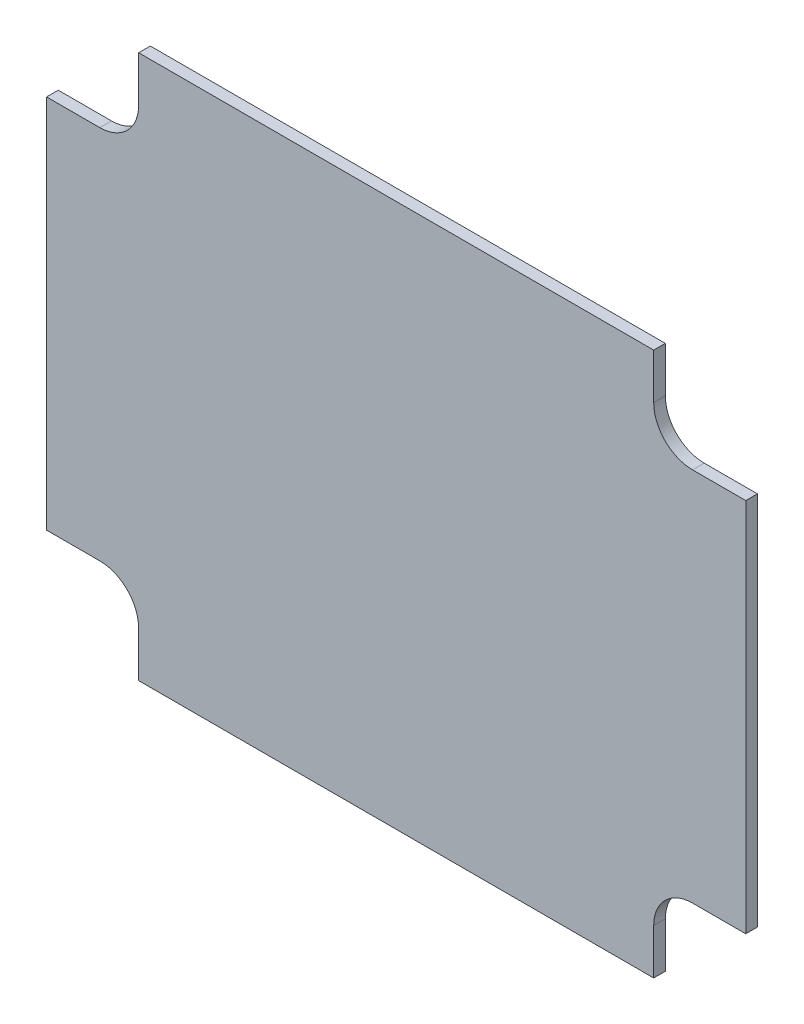
ISO-10303-21;
HEADER;
FILE_DESCRIPTION(('STEP AP214'),'2;1');
FILE_NAME('part.step','',(''),(''),'','','');
FILE_SCHEMA(('AUTOMOTIVE_DESIGN { 1 0 10303 214 1 1 1 1 }'));
ENDSEC;
DATA;
#1=APPLICATION_CONTEXT('core data for automotive mechanical design processes');
#2=APPLICATION_PROTOCOL_DEFINITION('international standard','automotive_design',2000,#1);
#3=PRODUCT_CONTEXT('',#1,'mechanical');
#4=PRODUCT('Part','Part','',(#3));
#5=PRODUCT_RELATED_PRODUCT_CATEGORY('part','',(#4));
#6=PRODUCT_DEFINITION_FORMATION('','',#4);
#7=PRODUCT_DEFINITION_CONTEXT('part definition',#1,'design');
#8=PRODUCT_DEFINITION('design','',#6,#7);
#9=PRODUCT_DEFINITION_SHAPE('','',#8);
#10=(LENGTH_UNIT() NAMED_UNIT(*) SI_UNIT(.MILLI.,.METRE.));
#11=(NAMED_UNIT(*) PLANE_ANGLE_UNIT() SI_UNIT($,.RADIAN.));
#12=(NAMED_UNIT(*) SI_UNIT($,.STERADIAN.) SOLID_ANGLE_UNIT());
#13=UNCERTAINTY_MEASURE_WITH_UNIT(LENGTH_MEASURE(1.E-05),#10,'distance_accuracy_value','');
#14=(GEOMETRIC_REPRESENTATION_CONTEXT(3) GLOBAL_UNCERTAINTY_ASSIGNED_CONTEXT((#13)) GLOBAL_UNIT_ASSIGNED_CONTEXT((#10,
#11,#12)) REPRESENTATION_CONTEXT('',''));
#15=CARTESIAN_POINT('',(0.,0.,0.));
#16=DIRECTION('',(0.,0.,1.));
#17=DIRECTION('',(1.,0.,0.));
#18=AXIS2_PLACEMENT_3D('',#15,#16,#17);
#19=CARTESIAN_POINT('',(-33.22373701131,0.,1.5));
#20=DIRECTION('',(-1.,0.,0.));
#21=DIRECTION('',(0.,-1.,0.));
#22=AXIS2_PLACEMENT_3D('',#19,#20,#21);
#23=PLANE('',#22);
#24=DIRECTION('',(0.,1.,0.));
#25=VECTOR('',#24,1.);
#26=CARTESIAN_POINT('',(-33.22373701131,0.,0.));
#27=LINE('',#26,#25);
#28=CARTESIAN_POINT('',(-33.2237370113099,28.3137276237492,0.));
#29=VERTEX_POINT('',#28);
#30=CARTESIAN_POINT('',(-33.2237370113099,34.1637276237492,0.));
#31=VERTEX_POINT('',#30);
#32=EDGE_CURVE('E200',#29,#31,#27,.T.);
#33=ORIENTED_EDGE('',*,*,#32,.F.);
#34=DIRECTION('',(0.,0.,-1.));
#35=VECTOR('',#34,1.);
#36=CARTESIAN_POINT('',(-33.2237370113099,28.3137276237492,1.5));
#37=LINE('',#36,#35);
#38=CARTESIAN_POINT('',(-33.2237370113099,28.3137276237492,1.5));
#39=VERTEX_POINT('',#38);
#40=EDGE_CURVE('E54',#29,#39,#37,.F.);
#41=ORIENTED_EDGE('',*,*,#40,.T.);
#42=DIRECTION('',(0.,1.,0.));
#43=VECTOR('',#42,1.);
#44=CARTESIAN_POINT('',(-33.22373701131,0.,1.5));
#45=LINE('',#44,#43);
#46=CARTESIAN_POINT('',(-33.2237370113099,34.1637276237492,1.5));
#47=VERTEX_POINT('',#46);
#48=EDGE_CURVE('E161',#39,#47,#45,.T.);
#49=ORIENTED_EDGE('',*,*,#48,.T.);
#50=DIRECTION('',(0.,0.,-1.));
#51=VECTOR('',#50,1.);
#52=CARTESIAN_POINT('',(-33.2237370113099,34.1637276237492,1.5));
#53=LINE('',#52,#51);
#54=EDGE_CURVE('E199',#47,#31,#53,.T.);
#55=ORIENTED_EDGE('',*,*,#54,.T.);
#56=EDGE_LOOP('',(#33,#41,#49,#55));
#57=FACE_BOUND('',#56,.T.);
#58=ADVANCED_FACE('F39',(#57),#23,.T.);
#59=CARTESIAN_POINT('',(0.,23.3137276237492,1.5));
#60=DIRECTION('',(0.,-1.,0.));
#61=DIRECTION('',(1.,0.,0.));
#62=AXIS2_PLACEMENT_3D('',#59,#60,#61);
#63=PLANE('',#62);
#64=DIRECTION('',(-1.,0.,0.));
#65=VECTOR('',#64,1.);
#66=CARTESIAN_POINT('',(0.,23.3137276237492,1.5));
#67=LINE('',#66,#65);
#68=CARTESIAN_POINT('',(-38.2237370113099,23.3137276237492,1.5));
#69=VERTEX_POINT('',#68);
#70=CARTESIAN_POINT('',(-45.0737370113099,23.3137276237492,1.5));
#71=VERTEX_POINT('',#70);
#72=EDGE_CURVE('E150',#69,#71,#67,.T.);
#73=ORIENTED_EDGE('',*,*,#72,.F.);
#74=DIRECTION('',(0.,0.,-1.));
#75=VECTOR('',#74,1.);
#76=CARTESIAN_POINT('',(-38.2237370113099,23.3137276237492,1.5));
#77=LINE('',#76,#75);
#78=CARTESIAN_POINT('',(-38.2237370113099,23.3137276237492,0.));
#79=VERTEX_POINT('',#78);
#80=EDGE_CURVE('E258',#69,#79,#77,.T.);
#81=ORIENTED_EDGE('',*,*,#80,.T.);
#82=DIRECTION('',(-1.,0.,0.));
#83=VECTOR('',#82,1.);
#84=CARTESIAN_POINT('',(0.,23.3137276237492,0.));
#85=LINE('',#84,#83);
#86=CARTESIAN_POINT('',(-45.0737370113099,23.3137276237492,0.));
#87=VERTEX_POINT('',#86);
#88=EDGE_CURVE('E166',#79,#87,#85,.T.);
#89=ORIENTED_EDGE('',*,*,#88,.T.);
#90=DIRECTION('',(0.,0.,-1.));
#91=VECTOR('',#90,1.);
#92=CARTESIAN_POINT('',(-45.0737370113099,23.3137276237492,1.5));
#93=LINE('',#92,#91);
#94=EDGE_CURVE('E164',#71,#87,#93,.T.);
#95=ORIENTED_EDGE('',*,*,#94,.F.);
#96=EDGE_LOOP('',(#73,#81,#89,#95));
#97=FACE_BOUND('',#96,.T.);
#98=ADVANCED_FACE('F165',(#97),#63,.F.);
#99=CARTESIAN_POINT('',(-45.0737370113099,0.,1.5));
#100=DIRECTION('',(1.,0.,0.));
#101=DIRECTION('',(0.,0.,-1.));
#102=AXIS2_PLACEMENT_3D('',#99,#100,#101);
#103=PLANE('',#102);
#104=DIRECTION('',(0.,-1.,0.));
#105=VECTOR('',#104,1.);
#106=CARTESIAN_POINT('',(-45.0737370113099,0.,0.));
#107=LINE('',#106,#105);
#108=CARTESIAN_POINT('',(-45.0737370113099,-24.9862723762508,0.));
#109=VERTEX_POINT('',#108);
#110=EDGE_CURVE('E203',#87,#109,#107,.T.);
#111=ORIENTED_EDGE('',*,*,#110,.T.);
#112=DIRECTION('',(0.,0.,-1.));
#113=VECTOR('',#112,1.);
#114=CARTESIAN_POINT('',(-45.0737370113099,-24.9862723762508,1.5));
#115=LINE('',#114,#113);
#116=CARTESIAN_POINT('',(-45.0737370113099,-24.9862723762508,1.5));
#117=VERTEX_POINT('',#116);
#118=EDGE_CURVE('E171',#117,#109,#115,.T.);
#119=ORIENTED_EDGE('',*,*,#118,.F.);
#120=DIRECTION('',(0.,-1.,0.));
#121=VECTOR('',#120,1.);
#122=CARTESIAN_POINT('',(-45.0737370113099,0.,1.5));
#123=LINE('',#122,#121);
#124=EDGE_CURVE('E155',#71,#117,#123,.T.);
#125=ORIENTED_EDGE('',*,*,#124,.F.);
#126=ORIENTED_EDGE('',*,*,#94,.T.);
#127=EDGE_LOOP('',(#111,#119,#125,#126));
#128=FACE_BOUND('',#127,.T.);
#129=ADVANCED_FACE('F173',(#128),#103,.F.);
#130=CARTESIAN_POINT('',(0.,-24.9862723762508,1.5));
#131=DIRECTION('',(0.,-1.,0.));
#132=DIRECTION('',(0.,0.,-1.));
#133=AXIS2_PLACEMENT_3D('',#130,#131,#132);
#134=PLANE('',#133);
#135=DIRECTION('',(-1.,0.,0.));
#136=VECTOR('',#135,1.);
#137=CARTESIAN_POINT('',(0.,-24.9862723762508,0.));
#138=LINE('',#137,#136);
#139=CARTESIAN_POINT('',(-38.2237370113099,-24.9862723762508,0.));
#140=VERTEX_POINT('',#139);
#141=EDGE_CURVE('E205',#140,#109,#138,.T.);
#142=ORIENTED_EDGE('',*,*,#141,.F.);
#143=DIRECTION('',(0.,0.,-1.));
#144=VECTOR('',#143,1.);
#145=CARTESIAN_POINT('',(-38.2237370113099,-24.9862723762508,1.5));
#146=LINE('',#145,#144);
#147=CARTESIAN_POINT('',(-38.2237370113099,-24.9862723762508,1.5));
#148=VERTEX_POINT('',#147);
#149=EDGE_CURVE('E246',#140,#148,#146,.F.);
#150=ORIENTED_EDGE('',*,*,#149,.T.);
#151=DIRECTION('',(-1.,0.,0.));
#152=VECTOR('',#151,1.);
#153=CARTESIAN_POINT('',(0.,-24.9862723762508,1.5));
#154=LINE('',#153,#152);
#155=EDGE_CURVE('E175',#148,#117,#154,.T.);
#156=ORIENTED_EDGE('',*,*,#155,.T.);
#157=ORIENTED_EDGE('',*,*,#118,.T.);
#158=EDGE_LOOP('',(#142,#150,#156,#157));
#159=FACE_BOUND('',#158,.T.);
#160=ADVANCED_FACE('F324',(#159),#134,.T.);
#161=CARTESIAN_POINT('',(-33.2237370113099,0.,1.5));
#162=DIRECTION('',(1.,0.,0.));
#163=DIRECTION('',(0.,0.,-1.));
#164=AXIS2_PLACEMENT_3D('',#161,#162,#163);
#165=PLANE('',#164);
#166=DIRECTION('',(0.,-1.,0.));
#167=VECTOR('',#166,1.);
#168=CARTESIAN_POINT('',(-33.2237370113099,0.,1.5));
#169=LINE('',#168,#167);
#170=CARTESIAN_POINT('',(-33.2237370113099,-29.9862723762508,1.5));
#171=VERTEX_POINT('',#170);
#172=CARTESIAN_POINT('',(-33.2237370113099,-35.8362723762508,1.5));
#173=VERTEX_POINT('',#172);
#174=EDGE_CURVE('E177',#171,#173,#169,.T.);
#175=ORIENTED_EDGE('',*,*,#174,.F.);
#176=DIRECTION('',(0.,0.,-1.));
#177=VECTOR('',#176,1.);
#178=CARTESIAN_POINT('',(-33.2237370113099,-29.9862723762508,1.5));
#179=LINE('',#178,#177);
#180=CARTESIAN_POINT('',(-33.2237370113099,-29.9862723762508,0.));
#181=VERTEX_POINT('',#180);
#182=EDGE_CURVE('E170',#171,#181,#179,.T.);
#183=ORIENTED_EDGE('',*,*,#182,.T.);
#184=DIRECTION('',(0.,-1.,0.));
#185=VECTOR('',#184,1.);
#186=CARTESIAN_POINT('',(-33.2237370113099,0.,0.));
#187=LINE('',#186,#185);
#188=CARTESIAN_POINT('',(-33.2237370113099,-35.8362723762508,0.));
#189=VERTEX_POINT('',#188);
#190=EDGE_CURVE('E207',#181,#189,#187,.T.);
#191=ORIENTED_EDGE('',*,*,#190,.T.);
#192=DIRECTION('',(0.,0.,-1.));
#193=VECTOR('',#192,1.);
#194=CARTESIAN_POINT('',(-33.2237370113099,-35.8362723762508,1.5));
#195=LINE('',#194,#193);
#196=EDGE_CURVE('E240',#173,#189,#195,.T.);
#197=ORIENTED_EDGE('',*,*,#196,.F.);
#198=EDGE_LOOP('',(#175,#183,#191,#197));
#199=FACE_BOUND('',#198,.T.);
#200=ADVANCED_FACE('F317',(#199),#165,.F.);
#201=CARTESIAN_POINT('',(0.,-35.8362723762508,1.5));
#202=DIRECTION('',(0.,1.,0.));
#203=DIRECTION('',(0.,0.,1.));
#204=AXIS2_PLACEMENT_3D('',#201,#202,#203);
#205=PLANE('',#204);
#206=DIRECTION('',(1.,0.,0.));
#207=VECTOR('',#206,1.);
#208=CARTESIAN_POINT('',(0.,-35.8362723762508,0.));
#209=LINE('',#208,#207);
#210=CARTESIAN_POINT('',(33.0762629886901,-35.8362723762508,0.));
#211=VERTEX_POINT('',#210);
#212=EDGE_CURVE('E209',#189,#211,#209,.T.);
#213=ORIENTED_EDGE('',*,*,#212,.T.);
#214=DIRECTION('',(0.,0.,-1.));
#215=VECTOR('',#214,1.);
#216=CARTESIAN_POINT('',(33.0762629886901,-35.8362723762508,1.5));
#217=LINE('',#216,#215);
#218=CARTESIAN_POINT('',(33.0762629886901,-35.8362723762508,1.5));
#219=VERTEX_POINT('',#218);
#220=EDGE_CURVE('E237',#219,#211,#217,.T.);
#221=ORIENTED_EDGE('',*,*,#220,.F.);
#222=DIRECTION('',(1.,0.,0.));
#223=VECTOR('',#222,1.);
#224=CARTESIAN_POINT('',(0.,-35.8362723762508,1.5));
#225=LINE('',#224,#223);
#226=EDGE_CURVE('E182',#173,#219,#225,.T.);
#227=ORIENTED_EDGE('',*,*,#226,.F.);
#228=ORIENTED_EDGE('',*,*,#196,.T.);
#229=EDGE_LOOP('',(#213,#221,#227,#228));
#230=FACE_BOUND('',#229,.T.);
#231=ADVANCED_FACE('F312',(#230),#205,.F.);
#232=CARTESIAN_POINT('',(33.0762629886901,0.,1.5));
#233=DIRECTION('',(1.,0.,0.));
#234=DIRECTION('',(0.,0.,-1.));
#235=AXIS2_PLACEMENT_3D('',#232,#233,#234);
#236=PLANE('',#235);
#237=DIRECTION('',(0.,-1.,0.));
#238=VECTOR('',#237,1.);
#239=CARTESIAN_POINT('',(33.0762629886901,0.,0.));
#240=LINE('',#239,#238);
#241=CARTESIAN_POINT('',(33.0762629886901,-29.9862723762508,0.));
#242=VERTEX_POINT('',#241);
#243=EDGE_CURVE('E212',#242,#211,#240,.T.);
#244=ORIENTED_EDGE('',*,*,#243,.F.);
#245=DIRECTION('',(0.,0.,-1.));
#246=VECTOR('',#245,1.);
#247=CARTESIAN_POINT('',(33.0762629886901,-29.9862723762508,1.5));
#248=LINE('',#247,#246);
#249=CARTESIAN_POINT('',(33.0762629886901,-29.9862723762508,1.5));
#250=VERTEX_POINT('',#249);
#251=EDGE_CURVE('E251',#242,#250,#248,.F.);
#252=ORIENTED_EDGE('',*,*,#251,.T.);
#253=DIRECTION('',(0.,-1.,0.));
#254=VECTOR('',#253,1.);
#255=CARTESIAN_POINT('',(33.0762629886901,0.,1.5));
#256=LINE('',#255,#254);
#257=EDGE_CURVE('E185',#250,#219,#256,.T.);
#258=ORIENTED_EDGE('',*,*,#257,.T.);
#259=ORIENTED_EDGE('',*,*,#220,.T.);
#260=EDGE_LOOP('',(#244,#252,#258,#259));
#261=FACE_BOUND('',#260,.T.);
#262=ADVANCED_FACE('F306',(#261),#236,.T.);
#263=CARTESIAN_POINT('',(0.,-24.9862723762508,1.5));
#264=DIRECTION('',(0.,1.,0.));
#265=DIRECTION('',(0.,0.,1.));
#266=AXIS2_PLACEMENT_3D('',#263,#264,#265);
#267=PLANE('',#266);
#268=DIRECTION('',(1.,0.,0.));
#269=VECTOR('',#268,1.);
#270=CARTESIAN_POINT('',(0.,-24.9862723762508,1.5));
#271=LINE('',#270,#269);
#272=CARTESIAN_POINT('',(38.0762629886901,-24.9862723762508,1.5));
#273=VERTEX_POINT('',#272);
#274=CARTESIAN_POINT('',(44.9262629886901,-24.9862723762508,1.5));
#275=VERTEX_POINT('',#274);
#276=EDGE_CURVE('E187',#273,#275,#271,.T.);
#277=ORIENTED_EDGE('',*,*,#276,.F.);
#278=DIRECTION('',(0.,0.,-1.));
#279=VECTOR('',#278,1.);
#280=CARTESIAN_POINT('',(38.0762629886901,-24.9862723762508,1.5));
#281=LINE('',#280,#279);
#282=CARTESIAN_POINT('',(38.0762629886901,-24.9862723762508,0.));
#283=VERTEX_POINT('',#282);
#284=EDGE_CURVE('E248',#273,#283,#281,.T.);
#285=ORIENTED_EDGE('',*,*,#284,.T.);
#286=DIRECTION('',(1.,0.,0.));
#287=VECTOR('',#286,1.);
#288=CARTESIAN_POINT('',(0.,-24.9862723762508,0.));
#289=LINE('',#288,#287);
#290=CARTESIAN_POINT('',(44.9262629886901,-24.9862723762508,0.));
#291=VERTEX_POINT('',#290);
#292=EDGE_CURVE('E214',#283,#291,#289,.T.);
#293=ORIENTED_EDGE('',*,*,#292,.T.);
#294=DIRECTION('',(0.,0.,-1.));
#295=VECTOR('',#294,1.);
#296=CARTESIAN_POINT('',(44.9262629886901,-24.9862723762508,1.5));
#297=LINE('',#296,#295);
#298=EDGE_CURVE('E234',#275,#291,#297,.T.);
#299=ORIENTED_EDGE('',*,*,#298,.F.);
#300=EDGE_LOOP('',(#277,#285,#293,#299));
#301=FACE_BOUND('',#300,.T.);
#302=ADVANCED_FACE('F298',(#301),#267,.F.);
#303=CARTESIAN_POINT('',(44.9262629886901,0.,1.5));
#304=DIRECTION('',(-1.,0.,0.));
#305=DIRECTION('',(0.,-1.,0.));
#306=AXIS2_PLACEMENT_3D('',#303,#304,#305);
#307=PLANE('',#306);
#308=DIRECTION('',(0.,1.,0.));
#309=VECTOR('',#308,1.);
#310=CARTESIAN_POINT('',(44.9262629886901,0.,0.));
#311=LINE('',#310,#309);
#312=CARTESIAN_POINT('',(44.9262629886901,23.3137276237493,0.));
#313=VERTEX_POINT('',#312);
#314=EDGE_CURVE('E216',#291,#313,#311,.T.);
#315=ORIENTED_EDGE('',*,*,#314,.T.);
#316=DIRECTION('',(0.,0.,-1.));
#317=VECTOR('',#316,1.);
#318=CARTESIAN_POINT('',(44.9262629886901,23.3137276237493,1.5));
#319=LINE('',#318,#317);
#320=CARTESIAN_POINT('',(44.9262629886901,23.3137276237493,1.5));
#321=VERTEX_POINT('',#320);
#322=EDGE_CURVE('E231',#321,#313,#319,.T.);
#323=ORIENTED_EDGE('',*,*,#322,.F.);
#324=DIRECTION('',(0.,1.,0.));
#325=VECTOR('',#324,1.);
#326=CARTESIAN_POINT('',(44.9262629886901,0.,1.5));
#327=LINE('',#326,#325);
#328=EDGE_CURVE('E189',#275,#321,#327,.T.);
#329=ORIENTED_EDGE('',*,*,#328,.F.);
#330=ORIENTED_EDGE('',*,*,#298,.T.);
#331=EDGE_LOOP('',(#315,#323,#329,#330));
#332=FACE_BOUND('',#331,.T.);
#333=ADVANCED_FACE('F292',(#332),#307,.F.);
#334=CARTESIAN_POINT('',(0.,23.3137276237493,1.5));
#335=DIRECTION('',(0.,1.,0.));
#336=DIRECTION('',(-1.,0.,0.));
#337=AXIS2_PLACEMENT_3D('',#334,#335,#336);
#338=PLANE('',#337);
#339=DIRECTION('',(1.,0.,0.));
#340=VECTOR('',#339,1.);
#341=CARTESIAN_POINT('',(0.,23.3137276237493,0.));
#342=LINE('',#341,#340);
#343=CARTESIAN_POINT('',(38.0762629886901,23.3137276237493,0.));
#344=VERTEX_POINT('',#343);
#345=EDGE_CURVE('E219',#344,#313,#342,.T.);
#346=ORIENTED_EDGE('',*,*,#345,.F.);
#347=DIRECTION('',(0.,0.,-1.));
#348=VECTOR('',#347,1.);
#349=CARTESIAN_POINT('',(38.0762629886901,23.3137276237493,1.5));
#350=LINE('',#349,#348);
#351=CARTESIAN_POINT('',(38.0762629886901,23.3137276237493,1.5));
#352=VERTEX_POINT('',#351);
#353=EDGE_CURVE('E256',#344,#352,#350,.F.);
#354=ORIENTED_EDGE('',*,*,#353,.T.);
#355=DIRECTION('',(1.,0.,0.));
#356=VECTOR('',#355,1.);
#357=CARTESIAN_POINT('',(0.,23.3137276237493,1.5));
#358=LINE('',#357,#356);
#359=EDGE_CURVE('E192',#352,#321,#358,.T.);
#360=ORIENTED_EDGE('',*,*,#359,.T.);
#361=ORIENTED_EDGE('',*,*,#322,.T.);
#362=EDGE_LOOP('',(#346,#354,#360,#361));
#363=FACE_BOUND('',#362,.T.);
#364=ADVANCED_FACE('F288',(#363),#338,.T.);
#365=CARTESIAN_POINT('',(33.07626298869,0.,1.5));
#366=DIRECTION('',(-1.,0.,0.));
#367=DIRECTION('',(0.,-1.,0.));
#368=AXIS2_PLACEMENT_3D('',#365,#366,#367);
#369=PLANE('',#368);
#370=DIRECTION('',(0.,1.,0.));
#371=VECTOR('',#370,1.);
#372=CARTESIAN_POINT('',(33.07626298869,0.,1.5));
#373=LINE('',#372,#371);
#374=CARTESIAN_POINT('',(33.0762629886901,28.3137276237493,1.5));
#375=VERTEX_POINT('',#374);
#376=CARTESIAN_POINT('',(33.0762629886901,34.1637276237492,1.5));
#377=VERTEX_POINT('',#376);
#378=EDGE_CURVE('E194',#375,#377,#373,.T.);
#379=ORIENTED_EDGE('',*,*,#378,.F.);
#380=DIRECTION('',(0.,0.,-1.));
#381=VECTOR('',#380,1.);
#382=CARTESIAN_POINT('',(33.0762629886901,28.3137276237493,1.5));
#383=LINE('',#382,#381);
#384=CARTESIAN_POINT('',(33.0762629886901,28.3137276237493,0.));
#385=VERTEX_POINT('',#384);
#386=EDGE_CURVE('E253',#375,#385,#383,.T.);
#387=ORIENTED_EDGE('',*,*,#386,.T.);
#388=DIRECTION('',(0.,1.,0.));
#389=VECTOR('',#388,1.);
#390=CARTESIAN_POINT('',(33.07626298869,0.,0.));
#391=LINE('',#390,#389);
#392=CARTESIAN_POINT('',(33.0762629886901,34.1637276237492,0.));
#393=VERTEX_POINT('',#392);
#394=EDGE_CURVE('E221',#385,#393,#391,.T.);
#395=ORIENTED_EDGE('',*,*,#394,.T.);
#396=DIRECTION('',(0.,0.,-1.));
#397=VECTOR('',#396,1.);
#398=CARTESIAN_POINT('',(33.0762629886901,34.1637276237492,1.5));
#399=LINE('',#398,#397);
#400=EDGE_CURVE('E228',#377,#393,#399,.T.);
#401=ORIENTED_EDGE('',*,*,#400,.F.);
#402=EDGE_LOOP('',(#379,#387,#395,#401));
#403=FACE_BOUND('',#402,.T.);
#404=ADVANCED_FACE('F281',(#403),#369,.F.);
#405=CARTESIAN_POINT('',(0.,34.1637276237492,1.5));
#406=DIRECTION('',(0.,1.,0.));
#407=DIRECTION('',(0.,0.,1.));
#408=AXIS2_PLACEMENT_3D('',#405,#406,#407);
#409=PLANE('',#408);
#410=DIRECTION('',(1.,0.,0.));
#411=VECTOR('',#410,1.);
#412=CARTESIAN_POINT('',(0.,34.1637276237492,0.));
#413=LINE('',#412,#411);
#414=EDGE_CURVE('E223',#31,#393,#413,.T.);
#415=ORIENTED_EDGE('',*,*,#414,.F.);
#416=ORIENTED_EDGE('',*,*,#54,.F.);
#417=DIRECTION('',(1.,0.,0.));
#418=VECTOR('',#417,1.);
#419=CARTESIAN_POINT('',(0.,34.1637276237492,1.5));
#420=LINE('',#419,#418);
#421=EDGE_CURVE('E196',#47,#377,#420,.T.);
#422=ORIENTED_EDGE('',*,*,#421,.T.);
#423=ORIENTED_EDGE('',*,*,#400,.T.);
#424=EDGE_LOOP('',(#415,#416,#422,#423));
#425=FACE_BOUND('',#424,.T.);
#426=ADVANCED_FACE('F384',(#425),#409,.T.);
#427=CARTESIAN_POINT('',(0.,0.,1.5));
#428=DIRECTION('',(0.,0.,1.));
#429=DIRECTION('',(1.,0.,0.));
#430=AXIS2_PLACEMENT_3D('',#427,#428,#429);
#431=PLANE('',#430);
#432=ORIENTED_EDGE('',*,*,#48,.F.);
#433=CARTESIAN_POINT('',(-38.2237370113099,28.3137276237492,1.5));
#434=DIRECTION('',(0.,0.,1.));
#435=DIRECTION('',(1.,0.,0.));
#436=AXIS2_PLACEMENT_3D('',#433,#434,#435);
#437=CIRCLE('',#436,5.);
#438=EDGE_CURVE('E11',#39,#69,#437,.F.);
#439=ORIENTED_EDGE('',*,*,#438,.T.);
#440=ORIENTED_EDGE('',*,*,#72,.T.);
#441=ORIENTED_EDGE('',*,*,#124,.T.);
#442=ORIENTED_EDGE('',*,*,#155,.F.);
#443=CARTESIAN_POINT('',(-38.2237370113099,-29.9862723762508,1.5));
#444=DIRECTION('',(0.,0.,1.));
#445=DIRECTION('',(1.,0.,0.));
#446=AXIS2_PLACEMENT_3D('',#443,#444,#445);
#447=CIRCLE('',#446,5.);
#448=EDGE_CURVE('E263',#148,#171,#447,.F.);
#449=ORIENTED_EDGE('',*,*,#448,.T.);
#450=ORIENTED_EDGE('',*,*,#174,.T.);
#451=ORIENTED_EDGE('',*,*,#226,.T.);
#452=ORIENTED_EDGE('',*,*,#257,.F.);
#453=CARTESIAN_POINT('',(38.0762629886901,-29.9862723762508,1.5));
#454=DIRECTION('',(0.,0.,1.));
#455=DIRECTION('',(1.,0.,0.));
#456=AXIS2_PLACEMENT_3D('',#453,#454,#455);
#457=CIRCLE('',#456,5.);
#458=EDGE_CURVE('E267',#250,#273,#457,.F.);
#459=ORIENTED_EDGE('',*,*,#458,.T.);
#460=ORIENTED_EDGE('',*,*,#276,.T.);
#461=ORIENTED_EDGE('',*,*,#328,.T.);
#462=ORIENTED_EDGE('',*,*,#359,.F.);
#463=CARTESIAN_POINT('',(38.0762629886901,28.3137276237493,1.5));
#464=DIRECTION('',(0.,0.,1.));
#465=DIRECTION('',(1.,0.,0.));
#466=AXIS2_PLACEMENT_3D('',#463,#464,#465);
#467=CIRCLE('',#466,5.);
#468=EDGE_CURVE('E271',#352,#375,#467,.F.);
#469=ORIENTED_EDGE('',*,*,#468,.T.);
#470=ORIENTED_EDGE('',*,*,#378,.T.);
#471=ORIENTED_EDGE('',*,*,#421,.F.);
#472=EDGE_LOOP('',(#432,#439,#440,#441,#442,#449,#450,#451,#452,#459,#460,#461,#462,#469,#470,#471));
#473=FACE_BOUND('',#472,.T.);
#474=ADVANCED_FACE('F152',(#473),#431,.T.);
#475=CARTESIAN_POINT('',(0.,0.,0.));
#476=DIRECTION('',(0.,0.,1.));
#477=DIRECTION('',(1.,0.,0.));
#478=AXIS2_PLACEMENT_3D('',#475,#476,#477);
#479=PLANE('',#478);
#480=ORIENTED_EDGE('',*,*,#88,.F.);
#481=CARTESIAN_POINT('',(-38.2237370113099,28.3137276237492,0.));
#482=DIRECTION('',(0.,0.,1.));
#483=DIRECTION('',(1.,0.,0.));
#484=AXIS2_PLACEMENT_3D('',#481,#482,#483);
#485=CIRCLE('',#484,5.);
#486=EDGE_CURVE('E47',#79,#29,#485,.T.);
#487=ORIENTED_EDGE('',*,*,#486,.T.);
#488=ORIENTED_EDGE('',*,*,#32,.T.);
#489=ORIENTED_EDGE('',*,*,#414,.T.);
#490=ORIENTED_EDGE('',*,*,#394,.F.);
#491=CARTESIAN_POINT('',(38.0762629886901,28.3137276237493,0.));
#492=DIRECTION('',(0.,0.,1.));
#493=DIRECTION('',(1.,0.,0.));
#494=AXIS2_PLACEMENT_3D('',#491,#492,#493);
#495=CIRCLE('',#494,5.);
#496=EDGE_CURVE('E269',#385,#344,#495,.T.);
#497=ORIENTED_EDGE('',*,*,#496,.T.);
#498=ORIENTED_EDGE('',*,*,#345,.T.);
#499=ORIENTED_EDGE('',*,*,#314,.F.);
#500=ORIENTED_EDGE('',*,*,#292,.F.);
#501=CARTESIAN_POINT('',(38.0762629886901,-29.9862723762508,0.));
#502=DIRECTION('',(0.,0.,1.));
#503=DIRECTION('',(1.,0.,0.));
#504=AXIS2_PLACEMENT_3D('',#501,#502,#503);
#505=CIRCLE('',#504,5.);
#506=EDGE_CURVE('E265',#283,#242,#505,.T.);
#507=ORIENTED_EDGE('',*,*,#506,.T.);
#508=ORIENTED_EDGE('',*,*,#243,.T.);
#509=ORIENTED_EDGE('',*,*,#212,.F.);
#510=ORIENTED_EDGE('',*,*,#190,.F.);
#511=CARTESIAN_POINT('',(-38.2237370113099,-29.9862723762508,0.));
#512=DIRECTION('',(0.,0.,1.));
#513=DIRECTION('',(1.,0.,0.));
#514=AXIS2_PLACEMENT_3D('',#511,#512,#513);
#515=CIRCLE('',#514,5.);
#516=EDGE_CURVE('E261',#181,#140,#515,.T.);
#517=ORIENTED_EDGE('',*,*,#516,.T.);
#518=ORIENTED_EDGE('',*,*,#141,.T.);
#519=ORIENTED_EDGE('',*,*,#110,.F.);
#520=EDGE_LOOP('',(#480,#487,#488,#489,#490,#497,#498,#499,#500,#507,#508,#509,#510,#517,#518,#519));
#521=FACE_BOUND('',#520,.T.);
#522=ADVANCED_FACE('F285',(#521),#479,.F.);
#523=CARTESIAN_POINT('',(-38.2237370113099,-29.9862723762508,1.5));
#524=DIRECTION('',(0.,0.,-1.));
#525=DIRECTION('',(-1.,0.,0.));
#526=AXIS2_PLACEMENT_3D('',#523,#524,#525);
#527=CYLINDRICAL_SURFACE('',#526,5.);
#528=ORIENTED_EDGE('',*,*,#448,.F.);
#529=ORIENTED_EDGE('',*,*,#149,.F.);
#530=ORIENTED_EDGE('',*,*,#516,.F.);
#531=ORIENTED_EDGE('',*,*,#182,.F.);
#532=EDGE_LOOP('',(#528,#529,#530,#531));
#533=FACE_BOUND('',#532,.T.);
#534=ADVANCED_FACE('F321',(#533),#527,.F.);
#535=CARTESIAN_POINT('',(38.0762629886901,-29.9862723762508,1.5));
#536=DIRECTION('',(0.,0.,-1.));
#537=DIRECTION('',(-1.,0.,0.));
#538=AXIS2_PLACEMENT_3D('',#535,#536,#537);
#539=CYLINDRICAL_SURFACE('',#538,5.);
#540=ORIENTED_EDGE('',*,*,#458,.F.);
#541=ORIENTED_EDGE('',*,*,#251,.F.);
#542=ORIENTED_EDGE('',*,*,#506,.F.);
#543=ORIENTED_EDGE('',*,*,#284,.F.);
#544=EDGE_LOOP('',(#540,#541,#542,#543));
#545=FACE_BOUND('',#544,.T.);
#546=ADVANCED_FACE('F302',(#545),#539,.F.);
#547=CARTESIAN_POINT('',(38.0762629886901,28.3137276237493,1.5));
#548=DIRECTION('',(0.,0.,-1.));
#549=DIRECTION('',(-1.,0.,0.));
#550=AXIS2_PLACEMENT_3D('',#547,#548,#549);
#551=CYLINDRICAL_SURFACE('',#550,5.);
#552=ORIENTED_EDGE('',*,*,#468,.F.);
#553=ORIENTED_EDGE('',*,*,#353,.F.);
#554=ORIENTED_EDGE('',*,*,#496,.F.);
#555=ORIENTED_EDGE('',*,*,#386,.F.);
#556=EDGE_LOOP('',(#552,#553,#554,#555));
#557=FACE_BOUND('',#556,.T.);
#558=ADVANCED_FACE('F283',(#557),#551,.F.);
#559=CARTESIAN_POINT('',(-38.2237370113099,28.3137276237492,1.5));
#560=DIRECTION('',(0.,0.,-1.));
#561=DIRECTION('',(-1.,0.,0.));
#562=AXIS2_PLACEMENT_3D('',#559,#560,#561);
#563=CYLINDRICAL_SURFACE('',#562,5.);
#564=ORIENTED_EDGE('',*,*,#438,.F.);
#565=ORIENTED_EDGE('',*,*,#40,.F.);
#566=ORIENTED_EDGE('',*,*,#486,.F.);
#567=ORIENTED_EDGE('',*,*,#80,.F.);
#568=EDGE_LOOP('',(#564,#565,#566,#567));
#569=FACE_BOUND('',#568,.T.);
#570=ADVANCED_FACE('F41',(#569),#563,.F.);
#571=CLOSED_SHELL('',(#58,#98,#129,#160,#200,#231,#262,#302,#333,#364,#404,#426,#474,#522,#534,
#546,#558,#570));
#572=MANIFOLD_SOLID_BREP('B2',#571);
#573=ADVANCED_BREP_SHAPE_REPRESENTATION('',(#18,#572),#14);
#574=SHAPE_DEFINITION_REPRESENTATION(#9,#573);
ENDSEC;
END-ISO-10303-21;
